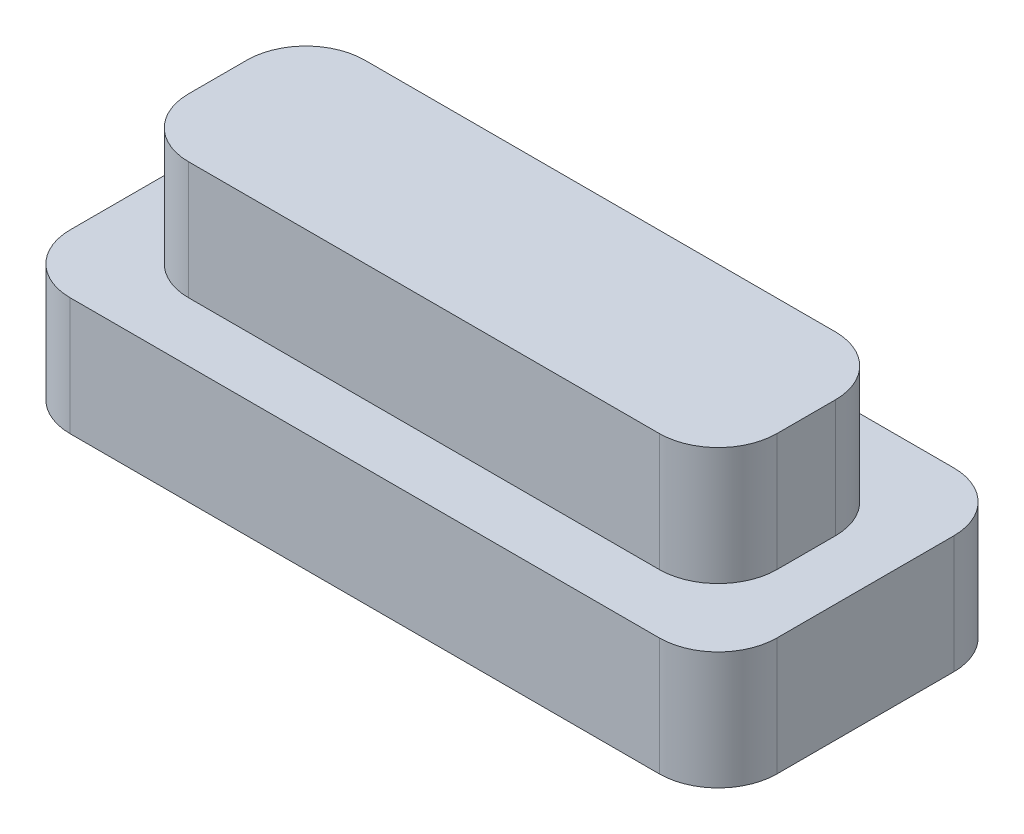
ISO-10303-21;
HEADER;
FILE_DESCRIPTION(('STEP AP214'),'2;1');
FILE_NAME('part.step','',(''),(''),'','','');
FILE_SCHEMA(('AUTOMOTIVE_DESIGN { 1 0 10303 214 1 1 1 1 }'));
ENDSEC;
DATA;
#1=APPLICATION_CONTEXT('core data for automotive mechanical design processes');
#2=APPLICATION_PROTOCOL_DEFINITION('international standard','automotive_design',2000,#1);
#3=PRODUCT_CONTEXT('',#1,'mechanical');
#4=PRODUCT('Part','Part','',(#3));
#5=PRODUCT_RELATED_PRODUCT_CATEGORY('part','',(#4));
#6=PRODUCT_DEFINITION_FORMATION('','',#4);
#7=PRODUCT_DEFINITION_CONTEXT('part definition',#1,'design');
#8=PRODUCT_DEFINITION('design','',#6,#7);
#9=PRODUCT_DEFINITION_SHAPE('','',#8);
#10=(LENGTH_UNIT() NAMED_UNIT(*) SI_UNIT(.MILLI.,.METRE.));
#11=(NAMED_UNIT(*) PLANE_ANGLE_UNIT() SI_UNIT($,.RADIAN.));
#12=(NAMED_UNIT(*) SI_UNIT($,.STERADIAN.) SOLID_ANGLE_UNIT());
#13=UNCERTAINTY_MEASURE_WITH_UNIT(LENGTH_MEASURE(1.E-05),#10,'distance_accuracy_value','');
#14=(GEOMETRIC_REPRESENTATION_CONTEXT(3) GLOBAL_UNCERTAINTY_ASSIGNED_CONTEXT((#13)) GLOBAL_UNIT_ASSIGNED_CONTEXT((#10,
#11,#12)) REPRESENTATION_CONTEXT('',''));
#15=CARTESIAN_POINT('',(0.,0.,0.));
#16=DIRECTION('',(0.,0.,1.));
#17=DIRECTION('',(1.,0.,0.));
#18=AXIS2_PLACEMENT_3D('',#15,#16,#17);
#19=CARTESIAN_POINT('',(-5.,2.,-1.5));
#20=DIRECTION('',(0.,-1.,0.));
#21=DIRECTION('',(0.,0.,-1.));
#22=AXIS2_PLACEMENT_3D('',#19,#20,#21);
#23=CYLINDRICAL_SURFACE('',#22,1.);
#24=CARTESIAN_POINT('',(-5.,0.,-1.5));
#25=DIRECTION('',(0.,1.,0.));
#26=DIRECTION('',(0.,0.,-1.));
#27=AXIS2_PLACEMENT_3D('',#24,#25,#26);
#28=CIRCLE('',#27,1.);
#29=CARTESIAN_POINT('',(-4.99999999999999,0.,-2.5));
#30=VERTEX_POINT('',#29);
#31=CARTESIAN_POINT('',(-6.,0.,-1.49999999999999));
#32=VERTEX_POINT('',#31);
#33=EDGE_CURVE('E141',#30,#32,#28,.T.);
#34=ORIENTED_EDGE('',*,*,#33,.T.);
#35=DIRECTION('',(0.,-1.,0.));
#36=VECTOR('',#35,1.);
#37=CARTESIAN_POINT('',(-6.,2.,-1.49999999999999));
#38=LINE('',#37,#36);
#39=CARTESIAN_POINT('',(-6.,2.,-1.49999999999999));
#40=VERTEX_POINT('',#39);
#41=EDGE_CURVE('E11',#40,#32,#38,.T.);
#42=ORIENTED_EDGE('',*,*,#41,.F.);
#43=CARTESIAN_POINT('',(-5.,2.,-1.5));
#44=DIRECTION('',(0.,1.,0.));
#45=DIRECTION('',(0.,0.,-1.));
#46=AXIS2_PLACEMENT_3D('',#43,#44,#45);
#47=CIRCLE('',#46,1.);
#48=CARTESIAN_POINT('',(-4.99999999999999,2.,-2.5));
#49=VERTEX_POINT('',#48);
#50=EDGE_CURVE('E157',#49,#40,#47,.T.);
#51=ORIENTED_EDGE('',*,*,#50,.F.);
#52=DIRECTION('',(0.,-1.,0.));
#53=VECTOR('',#52,1.);
#54=CARTESIAN_POINT('',(-4.99999999999999,2.,-2.5));
#55=LINE('',#54,#53);
#56=EDGE_CURVE('E137',#49,#30,#55,.T.);
#57=ORIENTED_EDGE('',*,*,#56,.T.);
#58=EDGE_LOOP('',(#34,#42,#51,#57));
#59=FACE_BOUND('',#58,.T.);
#60=ADVANCED_FACE('F33',(#59),#23,.T.);
#61=CARTESIAN_POINT('',(-6.,2.,-1.49999999999999));
#62=DIRECTION('',(1.,0.,0.));
#63=DIRECTION('',(0.,0.,-1.));
#64=AXIS2_PLACEMENT_3D('',#61,#62,#63);
#65=PLANE('',#64);
#66=DIRECTION('',(0.,0.,1.));
#67=VECTOR('',#66,1.);
#68=CARTESIAN_POINT('',(-6.,0.,-1.49999999999999));
#69=LINE('',#68,#67);
#70=CARTESIAN_POINT('',(-6.,0.,1.49999999999999));
#71=VERTEX_POINT('',#70);
#72=EDGE_CURVE('E144',#32,#71,#69,.T.);
#73=ORIENTED_EDGE('',*,*,#72,.T.);
#74=DIRECTION('',(0.,-1.,0.));
#75=VECTOR('',#74,1.);
#76=CARTESIAN_POINT('',(-6.,2.,1.49999999999999));
#77=LINE('',#76,#75);
#78=CARTESIAN_POINT('',(-6.,2.,1.49999999999999));
#79=VERTEX_POINT('',#78);
#80=EDGE_CURVE('E40',#79,#71,#77,.T.);
#81=ORIENTED_EDGE('',*,*,#80,.F.);
#82=DIRECTION('',(0.,0.,1.));
#83=VECTOR('',#82,1.);
#84=CARTESIAN_POINT('',(-6.,2.,-1.49999999999999));
#85=LINE('',#84,#83);
#86=EDGE_CURVE('E97',#40,#79,#85,.T.);
#87=ORIENTED_EDGE('',*,*,#86,.F.);
#88=ORIENTED_EDGE('',*,*,#41,.T.);
#89=EDGE_LOOP('',(#73,#81,#87,#88));
#90=FACE_BOUND('',#89,.T.);
#91=ADVANCED_FACE('F332',(#90),#65,.F.);
#92=CARTESIAN_POINT('',(-5.,2.,1.5));
#93=DIRECTION('',(0.,-1.,0.));
#94=DIRECTION('',(0.,0.,-1.));
#95=AXIS2_PLACEMENT_3D('',#92,#93,#94);
#96=CYLINDRICAL_SURFACE('',#95,1.);
#97=CARTESIAN_POINT('',(-5.,0.,1.5));
#98=DIRECTION('',(0.,1.,0.));
#99=DIRECTION('',(0.,0.,-1.));
#100=AXIS2_PLACEMENT_3D('',#97,#98,#99);
#101=CIRCLE('',#100,1.);
#102=CARTESIAN_POINT('',(-4.99999999999999,0.,2.5));
#103=VERTEX_POINT('',#102);
#104=EDGE_CURVE('E147',#71,#103,#101,.T.);
#105=ORIENTED_EDGE('',*,*,#104,.T.);
#106=DIRECTION('',(0.,-1.,0.));
#107=VECTOR('',#106,1.);
#108=CARTESIAN_POINT('',(-4.99999999999999,2.,2.5));
#109=LINE('',#108,#107);
#110=CARTESIAN_POINT('',(-4.99999999999999,2.,2.5));
#111=VERTEX_POINT('',#110);
#112=EDGE_CURVE('E164',#111,#103,#109,.T.);
#113=ORIENTED_EDGE('',*,*,#112,.F.);
#114=CARTESIAN_POINT('',(-5.,2.,1.5));
#115=DIRECTION('',(0.,1.,0.));
#116=DIRECTION('',(0.,0.,-1.));
#117=AXIS2_PLACEMENT_3D('',#114,#115,#116);
#118=CIRCLE('',#117,1.);
#119=EDGE_CURVE('E172',#79,#111,#118,.T.);
#120=ORIENTED_EDGE('',*,*,#119,.F.);
#121=ORIENTED_EDGE('',*,*,#80,.T.);
#122=EDGE_LOOP('',(#105,#113,#120,#121));
#123=FACE_BOUND('',#122,.T.);
#124=ADVANCED_FACE('F170',(#123),#96,.T.);
#125=CARTESIAN_POINT('',(-4.99999999999999,2.,2.5));
#126=DIRECTION('',(0.,0.,-1.));
#127=DIRECTION('',(-1.,0.,0.));
#128=AXIS2_PLACEMENT_3D('',#125,#126,#127);
#129=PLANE('',#128);
#130=DIRECTION('',(1.,0.,0.));
#131=VECTOR('',#130,1.);
#132=CARTESIAN_POINT('',(-4.99999999999999,0.,2.5));
#133=LINE('',#132,#131);
#134=CARTESIAN_POINT('',(4.99999999999999,0.,2.5));
#135=VERTEX_POINT('',#134);
#136=EDGE_CURVE('E149',#103,#135,#133,.T.);
#137=ORIENTED_EDGE('',*,*,#136,.T.);
#138=DIRECTION('',(0.,-1.,0.));
#139=VECTOR('',#138,1.);
#140=CARTESIAN_POINT('',(4.99999999999999,2.,2.5));
#141=LINE('',#140,#139);
#142=CARTESIAN_POINT('',(4.99999999999999,2.,2.5));
#143=VERTEX_POINT('',#142);
#144=EDGE_CURVE('E161',#143,#135,#141,.T.);
#145=ORIENTED_EDGE('',*,*,#144,.F.);
#146=DIRECTION('',(1.,0.,0.));
#147=VECTOR('',#146,1.);
#148=CARTESIAN_POINT('',(-4.99999999999999,2.,2.5));
#149=LINE('',#148,#147);
#150=EDGE_CURVE('E184',#111,#143,#149,.T.);
#151=ORIENTED_EDGE('',*,*,#150,.F.);
#152=ORIENTED_EDGE('',*,*,#112,.T.);
#153=EDGE_LOOP('',(#137,#145,#151,#152));
#154=FACE_BOUND('',#153,.T.);
#155=ADVANCED_FACE('F180',(#154),#129,.F.);
#156=CARTESIAN_POINT('',(5.,2.,1.5));
#157=DIRECTION('',(0.,-1.,0.));
#158=DIRECTION('',(0.,0.,-1.));
#159=AXIS2_PLACEMENT_3D('',#156,#157,#158);
#160=CYLINDRICAL_SURFACE('',#159,1.);
#161=CARTESIAN_POINT('',(5.,0.,1.5));
#162=DIRECTION('',(0.,1.,0.));
#163=DIRECTION('',(0.,0.,1.));
#164=AXIS2_PLACEMENT_3D('',#161,#162,#163);
#165=CIRCLE('',#164,1.);
#166=CARTESIAN_POINT('',(6.,0.,1.49999999999999));
#167=VERTEX_POINT('',#166);
#168=EDGE_CURVE('E151',#135,#167,#165,.T.);
#169=ORIENTED_EDGE('',*,*,#168,.T.);
#170=DIRECTION('',(0.,-1.,0.));
#171=VECTOR('',#170,1.);
#172=CARTESIAN_POINT('',(6.,2.,1.49999999999999));
#173=LINE('',#172,#171);
#174=CARTESIAN_POINT('',(6.,2.,1.49999999999999));
#175=VERTEX_POINT('',#174);
#176=EDGE_CURVE('E132',#175,#167,#173,.T.);
#177=ORIENTED_EDGE('',*,*,#176,.F.);
#178=CARTESIAN_POINT('',(5.,2.,1.5));
#179=DIRECTION('',(0.,1.,0.));
#180=DIRECTION('',(0.,0.,1.));
#181=AXIS2_PLACEMENT_3D('',#178,#179,#180);
#182=CIRCLE('',#181,1.);
#183=EDGE_CURVE('E120',#143,#175,#182,.T.);
#184=ORIENTED_EDGE('',*,*,#183,.F.);
#185=ORIENTED_EDGE('',*,*,#144,.T.);
#186=EDGE_LOOP('',(#169,#177,#184,#185));
#187=FACE_BOUND('',#186,.T.);
#188=ADVANCED_FACE('F183',(#187),#160,.T.);
#189=CARTESIAN_POINT('',(6.,2.,-1.49999999999999));
#190=DIRECTION('',(-1.,0.,0.));
#191=DIRECTION('',(0.,0.,1.));
#192=AXIS2_PLACEMENT_3D('',#189,#190,#191);
#193=PLANE('',#192);
#194=DIRECTION('',(0.,0.,-1.));
#195=VECTOR('',#194,1.);
#196=CARTESIAN_POINT('',(6.,0.,-1.49999999999999));
#197=LINE('',#196,#195);
#198=CARTESIAN_POINT('',(6.,0.,-1.49999999999999));
#199=VERTEX_POINT('',#198);
#200=EDGE_CURVE('E129',#167,#199,#197,.T.);
#201=ORIENTED_EDGE('',*,*,#200,.T.);
#202=DIRECTION('',(0.,-1.,0.));
#203=VECTOR('',#202,1.);
#204=CARTESIAN_POINT('',(6.,2.,-1.49999999999999));
#205=LINE('',#204,#203);
#206=CARTESIAN_POINT('',(6.,2.,-1.49999999999999));
#207=VERTEX_POINT('',#206);
#208=EDGE_CURVE('E126',#207,#199,#205,.T.);
#209=ORIENTED_EDGE('',*,*,#208,.F.);
#210=DIRECTION('',(0.,0.,-1.));
#211=VECTOR('',#210,1.);
#212=CARTESIAN_POINT('',(6.,2.,-1.49999999999999));
#213=LINE('',#212,#211);
#214=EDGE_CURVE('E113',#175,#207,#213,.T.);
#215=ORIENTED_EDGE('',*,*,#214,.F.);
#216=ORIENTED_EDGE('',*,*,#176,.T.);
#217=EDGE_LOOP('',(#201,#209,#215,#216));
#218=FACE_BOUND('',#217,.T.);
#219=ADVANCED_FACE('F127',(#218),#193,.F.);
#220=CARTESIAN_POINT('',(5.,2.,-1.5));
#221=DIRECTION('',(0.,-1.,0.));
#222=DIRECTION('',(0.,0.,-1.));
#223=AXIS2_PLACEMENT_3D('',#220,#221,#222);
#224=CYLINDRICAL_SURFACE('',#223,1.);
#225=CARTESIAN_POINT('',(5.,0.,-1.5));
#226=DIRECTION('',(0.,1.,0.));
#227=DIRECTION('',(0.,0.,1.));
#228=AXIS2_PLACEMENT_3D('',#225,#226,#227);
#229=CIRCLE('',#228,1.);
#230=CARTESIAN_POINT('',(4.99999999999999,0.,-2.5));
#231=VERTEX_POINT('',#230);
#232=EDGE_CURVE('E154',#199,#231,#229,.T.);
#233=ORIENTED_EDGE('',*,*,#232,.T.);
#234=DIRECTION('',(0.,-1.,0.));
#235=VECTOR('',#234,1.);
#236=CARTESIAN_POINT('',(4.99999999999999,2.,-2.5));
#237=LINE('',#236,#235);
#238=CARTESIAN_POINT('',(4.99999999999999,2.,-2.5));
#239=VERTEX_POINT('',#238);
#240=EDGE_CURVE('E133',#239,#231,#237,.T.);
#241=ORIENTED_EDGE('',*,*,#240,.F.);
#242=CARTESIAN_POINT('',(5.,2.,-1.5));
#243=DIRECTION('',(0.,1.,0.));
#244=DIRECTION('',(0.,0.,1.));
#245=AXIS2_PLACEMENT_3D('',#242,#243,#244);
#246=CIRCLE('',#245,1.);
#247=EDGE_CURVE('E117',#207,#239,#246,.T.);
#248=ORIENTED_EDGE('',*,*,#247,.F.);
#249=ORIENTED_EDGE('',*,*,#208,.T.);
#250=EDGE_LOOP('',(#233,#241,#248,#249));
#251=FACE_BOUND('',#250,.T.);
#252=ADVANCED_FACE('F135',(#251),#224,.T.);
#253=CARTESIAN_POINT('',(-4.99999999999999,2.,-2.5));
#254=DIRECTION('',(0.,0.,1.));
#255=DIRECTION('',(1.,0.,0.));
#256=AXIS2_PLACEMENT_3D('',#253,#254,#255);
#257=PLANE('',#256);
#258=DIRECTION('',(-1.,0.,0.));
#259=VECTOR('',#258,1.);
#260=CARTESIAN_POINT('',(-4.99999999999999,0.,-2.5));
#261=LINE('',#260,#259);
#262=EDGE_CURVE('E89',#231,#30,#261,.T.);
#263=ORIENTED_EDGE('',*,*,#262,.T.);
#264=ORIENTED_EDGE('',*,*,#56,.F.);
#265=DIRECTION('',(-1.,0.,0.));
#266=VECTOR('',#265,1.);
#267=CARTESIAN_POINT('',(-4.99999999999999,2.,-2.5));
#268=LINE('',#267,#266);
#269=EDGE_CURVE('E56',#239,#49,#268,.T.);
#270=ORIENTED_EDGE('',*,*,#269,.F.);
#271=ORIENTED_EDGE('',*,*,#240,.T.);
#272=EDGE_LOOP('',(#263,#264,#270,#271));
#273=FACE_BOUND('',#272,.T.);
#274=ADVANCED_FACE('F339',(#273),#257,.F.);
#275=CARTESIAN_POINT('',(-5.,2.,-1.5));
#276=DIRECTION('',(0.,-1.,0.));
#277=DIRECTION('',(0.,0.,-1.));
#278=AXIS2_PLACEMENT_3D('',#275,#276,#277);
#279=PLANE('',#278);
#280=CARTESIAN_POINT('',(3.995,2.,-0.495));
#281=DIRECTION('',(0.,-1.,0.));
#282=DIRECTION('',(0.,0.,-1.));
#283=AXIS2_PLACEMENT_3D('',#280,#281,#282);
#284=CIRCLE('',#283,1.);
#285=CARTESIAN_POINT('',(3.99499999999999,2.,-1.495));
#286=VERTEX_POINT('',#285);
#287=CARTESIAN_POINT('',(4.995,2.,-0.494999999999993));
#288=VERTEX_POINT('',#287);
#289=EDGE_CURVE('E212',#286,#288,#284,.T.);
#290=ORIENTED_EDGE('',*,*,#289,.T.);
#291=DIRECTION('',(0.,0.,1.));
#292=VECTOR('',#291,1.);
#293=CARTESIAN_POINT('',(4.995,2.,-0.494999999999993));
#294=LINE('',#293,#292);
#295=CARTESIAN_POINT('',(4.995,2.,0.494999999999993));
#296=VERTEX_POINT('',#295);
#297=EDGE_CURVE('E47',#288,#296,#294,.T.);
#298=ORIENTED_EDGE('',*,*,#297,.T.);
#299=CARTESIAN_POINT('',(3.995,2.,0.495));
#300=DIRECTION('',(0.,1.,0.));
#301=DIRECTION('',(0.,0.,1.));
#302=AXIS2_PLACEMENT_3D('',#299,#300,#301);
#303=CIRCLE('',#302,1.);
#304=CARTESIAN_POINT('',(3.99499999999999,2.,1.495));
#305=VERTEX_POINT('',#304);
#306=EDGE_CURVE('E231',#305,#296,#303,.T.);
#307=ORIENTED_EDGE('',*,*,#306,.F.);
#308=DIRECTION('',(1.,0.,0.));
#309=VECTOR('',#308,1.);
#310=CARTESIAN_POINT('',(-3.99499999999999,2.,1.495));
#311=LINE('',#310,#309);
#312=CARTESIAN_POINT('',(-3.99499999999999,2.,1.495));
#313=VERTEX_POINT('',#312);
#314=EDGE_CURVE('E228',#313,#305,#311,.T.);
#315=ORIENTED_EDGE('',*,*,#314,.F.);
#316=CARTESIAN_POINT('',(-3.995,2.,0.495));
#317=DIRECTION('',(0.,-1.,0.));
#318=DIRECTION('',(0.,0.,-1.));
#319=AXIS2_PLACEMENT_3D('',#316,#317,#318);
#320=CIRCLE('',#319,1.);
#321=CARTESIAN_POINT('',(-4.995,2.,0.494999999999994));
#322=VERTEX_POINT('',#321);
#323=EDGE_CURVE('E225',#313,#322,#320,.T.);
#324=ORIENTED_EDGE('',*,*,#323,.T.);
#325=DIRECTION('',(0.,0.,1.));
#326=VECTOR('',#325,1.);
#327=CARTESIAN_POINT('',(-4.995,2.,-0.494999999999993));
#328=LINE('',#327,#326);
#329=CARTESIAN_POINT('',(-4.995,2.,-0.494999999999993));
#330=VERTEX_POINT('',#329);
#331=EDGE_CURVE('E222',#330,#322,#328,.T.);
#332=ORIENTED_EDGE('',*,*,#331,.F.);
#333=CARTESIAN_POINT('',(-3.995,2.,-0.495));
#334=DIRECTION('',(0.,-1.,0.));
#335=DIRECTION('',(0.,0.,-1.));
#336=AXIS2_PLACEMENT_3D('',#333,#334,#335);
#337=CIRCLE('',#336,1.);
#338=CARTESIAN_POINT('',(-3.995,2.,-1.495));
#339=VERTEX_POINT('',#338);
#340=EDGE_CURVE('E219',#330,#339,#337,.T.);
#341=ORIENTED_EDGE('',*,*,#340,.T.);
#342=DIRECTION('',(1.,0.,0.));
#343=VECTOR('',#342,1.);
#344=CARTESIAN_POINT('',(-3.99499999999999,2.,-1.495));
#345=LINE('',#344,#343);
#346=EDGE_CURVE('E216',#339,#286,#345,.T.);
#347=ORIENTED_EDGE('',*,*,#346,.T.);
#348=EDGE_LOOP('',(#290,#298,#307,#315,#324,#332,#341,#347));
#349=FACE_BOUND('',#348,.T.);
#350=ORIENTED_EDGE('',*,*,#50,.T.);
#351=ORIENTED_EDGE('',*,*,#86,.T.);
#352=ORIENTED_EDGE('',*,*,#119,.T.);
#353=ORIENTED_EDGE('',*,*,#150,.T.);
#354=ORIENTED_EDGE('',*,*,#183,.T.);
#355=ORIENTED_EDGE('',*,*,#214,.T.);
#356=ORIENTED_EDGE('',*,*,#247,.T.);
#357=ORIENTED_EDGE('',*,*,#269,.T.);
#358=EDGE_LOOP('',(#350,#351,#352,#353,#354,#355,#356,#357));
#359=FACE_BOUND('',#358,.T.);
#360=ADVANCED_FACE('F115',(#349,#359),#279,.F.);
#361=CARTESIAN_POINT('',(-5.,0.,-1.5));
#362=DIRECTION('',(0.,-1.,0.));
#363=DIRECTION('',(0.,0.,-1.));
#364=AXIS2_PLACEMENT_3D('',#361,#362,#363);
#365=PLANE('',#364);
#366=ORIENTED_EDGE('',*,*,#33,.F.);
#367=ORIENTED_EDGE('',*,*,#262,.F.);
#368=ORIENTED_EDGE('',*,*,#232,.F.);
#369=ORIENTED_EDGE('',*,*,#200,.F.);
#370=ORIENTED_EDGE('',*,*,#168,.F.);
#371=ORIENTED_EDGE('',*,*,#136,.F.);
#372=ORIENTED_EDGE('',*,*,#104,.F.);
#373=ORIENTED_EDGE('',*,*,#72,.F.);
#374=EDGE_LOOP('',(#366,#367,#368,#369,#370,#371,#372,#373));
#375=FACE_BOUND('',#374,.T.);
#376=ADVANCED_FACE('F176',(#375),#365,.T.);
#377=CARTESIAN_POINT('',(4.995,4.,-0.494999999999993));
#378=DIRECTION('',(1.,0.,0.));
#379=DIRECTION('',(0.,0.,-1.));
#380=AXIS2_PLACEMENT_3D('',#377,#378,#379);
#381=PLANE('',#380);
#382=ORIENTED_EDGE('',*,*,#297,.F.);
#383=DIRECTION('',(0.,-1.,0.));
#384=VECTOR('',#383,1.);
#385=CARTESIAN_POINT('',(4.995,4.,-0.494999999999993));
#386=LINE('',#385,#384);
#387=CARTESIAN_POINT('',(4.995,4.,-0.494999999999993));
#388=VERTEX_POINT('',#387);
#389=EDGE_CURVE('E145',#388,#288,#386,.T.);
#390=ORIENTED_EDGE('',*,*,#389,.F.);
#391=DIRECTION('',(0.,0.,1.));
#392=VECTOR('',#391,1.);
#393=CARTESIAN_POINT('',(4.995,4.,-0.494999999999993));
#394=LINE('',#393,#392);
#395=CARTESIAN_POINT('',(4.995,4.,0.494999999999993));
#396=VERTEX_POINT('',#395);
#397=EDGE_CURVE('E215',#388,#396,#394,.T.);
#398=ORIENTED_EDGE('',*,*,#397,.T.);
#399=DIRECTION('',(0.,-1.,0.));
#400=VECTOR('',#399,1.);
#401=CARTESIAN_POINT('',(4.995,4.,0.494999999999993));
#402=LINE('',#401,#400);
#403=EDGE_CURVE('E190',#396,#296,#402,.T.);
#404=ORIENTED_EDGE('',*,*,#403,.T.);
#405=EDGE_LOOP('',(#382,#390,#398,#404));
#406=FACE_BOUND('',#405,.T.);
#407=ADVANCED_FACE('F258',(#406),#381,.T.);
#408=CARTESIAN_POINT('',(3.995,4.,-0.495));
#409=DIRECTION('',(0.,-1.,0.));
#410=DIRECTION('',(0.,0.,-1.));
#411=AXIS2_PLACEMENT_3D('',#408,#409,#410);
#412=CYLINDRICAL_SURFACE('',#411,1.);
#413=ORIENTED_EDGE('',*,*,#289,.F.);
#414=DIRECTION('',(0.,-1.,0.));
#415=VECTOR('',#414,1.);
#416=CARTESIAN_POINT('',(3.99499999999999,4.,-1.495));
#417=LINE('',#416,#415);
#418=CARTESIAN_POINT('',(3.99499999999999,4.,-1.495));
#419=VERTEX_POINT('',#418);
#420=EDGE_CURVE('E208',#419,#286,#417,.T.);
#421=ORIENTED_EDGE('',*,*,#420,.F.);
#422=CARTESIAN_POINT('',(3.995,4.,-0.495));
#423=DIRECTION('',(0.,-1.,0.));
#424=DIRECTION('',(0.,0.,-1.));
#425=AXIS2_PLACEMENT_3D('',#422,#423,#424);
#426=CIRCLE('',#425,1.);
#427=EDGE_CURVE('E193',#419,#388,#426,.T.);
#428=ORIENTED_EDGE('',*,*,#427,.T.);
#429=ORIENTED_EDGE('',*,*,#389,.T.);
#430=EDGE_LOOP('',(#413,#421,#428,#429));
#431=FACE_BOUND('',#430,.T.);
#432=ADVANCED_FACE('F273',(#431),#412,.T.);
#433=CARTESIAN_POINT('',(-3.99499999999999,4.,-1.495));
#434=DIRECTION('',(0.,0.,-1.));
#435=DIRECTION('',(-1.,0.,0.));
#436=AXIS2_PLACEMENT_3D('',#433,#434,#435);
#437=PLANE('',#436);
#438=ORIENTED_EDGE('',*,*,#346,.F.);
#439=DIRECTION('',(0.,-1.,0.));
#440=VECTOR('',#439,1.);
#441=CARTESIAN_POINT('',(-3.995,4.,-1.495));
#442=LINE('',#441,#440);
#443=CARTESIAN_POINT('',(-3.995,4.,-1.495));
#444=VERTEX_POINT('',#443);
#445=EDGE_CURVE('E205',#444,#339,#442,.T.);
#446=ORIENTED_EDGE('',*,*,#445,.F.);
#447=DIRECTION('',(1.,0.,0.));
#448=VECTOR('',#447,1.);
#449=CARTESIAN_POINT('',(-3.99499999999999,4.,-1.495));
#450=LINE('',#449,#448);
#451=EDGE_CURVE('E237',#444,#419,#450,.T.);
#452=ORIENTED_EDGE('',*,*,#451,.T.);
#453=ORIENTED_EDGE('',*,*,#420,.T.);
#454=EDGE_LOOP('',(#438,#446,#452,#453));
#455=FACE_BOUND('',#454,.T.);
#456=ADVANCED_FACE('F279',(#455),#437,.T.);
#457=CARTESIAN_POINT('',(-3.995,4.,-0.495));
#458=DIRECTION('',(0.,-1.,0.));
#459=DIRECTION('',(0.,0.,-1.));
#460=AXIS2_PLACEMENT_3D('',#457,#458,#459);
#461=CYLINDRICAL_SURFACE('',#460,1.);
#462=ORIENTED_EDGE('',*,*,#340,.F.);
#463=DIRECTION('',(0.,-1.,0.));
#464=VECTOR('',#463,1.);
#465=CARTESIAN_POINT('',(-4.995,4.,-0.494999999999993));
#466=LINE('',#465,#464);
#467=CARTESIAN_POINT('',(-4.995,4.,-0.494999999999993));
#468=VERTEX_POINT('',#467);
#469=EDGE_CURVE('E202',#468,#330,#466,.T.);
#470=ORIENTED_EDGE('',*,*,#469,.F.);
#471=CARTESIAN_POINT('',(-3.995,4.,-0.495));
#472=DIRECTION('',(0.,-1.,0.));
#473=DIRECTION('',(0.,0.,-1.));
#474=AXIS2_PLACEMENT_3D('',#471,#472,#473);
#475=CIRCLE('',#474,1.);
#476=EDGE_CURVE('E240',#468,#444,#475,.T.);
#477=ORIENTED_EDGE('',*,*,#476,.T.);
#478=ORIENTED_EDGE('',*,*,#445,.T.);
#479=EDGE_LOOP('',(#462,#470,#477,#478));
#480=FACE_BOUND('',#479,.T.);
#481=ADVANCED_FACE('F286',(#480),#461,.T.);
#482=CARTESIAN_POINT('',(-4.995,4.,-0.494999999999993));
#483=DIRECTION('',(1.,0.,0.));
#484=DIRECTION('',(0.,0.,-1.));
#485=AXIS2_PLACEMENT_3D('',#482,#483,#484);
#486=PLANE('',#485);
#487=ORIENTED_EDGE('',*,*,#331,.T.);
#488=DIRECTION('',(0.,-1.,0.));
#489=VECTOR('',#488,1.);
#490=CARTESIAN_POINT('',(-4.995,4.,0.494999999999994));
#491=LINE('',#490,#489);
#492=CARTESIAN_POINT('',(-4.995,4.,0.494999999999994));
#493=VERTEX_POINT('',#492);
#494=EDGE_CURVE('E199',#493,#322,#491,.T.);
#495=ORIENTED_EDGE('',*,*,#494,.F.);
#496=DIRECTION('',(0.,0.,1.));
#497=VECTOR('',#496,1.);
#498=CARTESIAN_POINT('',(-4.995,4.,-0.494999999999993));
#499=LINE('',#498,#497);
#500=EDGE_CURVE('E243',#468,#493,#499,.T.);
#501=ORIENTED_EDGE('',*,*,#500,.F.);
#502=ORIENTED_EDGE('',*,*,#469,.T.);
#503=EDGE_LOOP('',(#487,#495,#501,#502));
#504=FACE_BOUND('',#503,.T.);
#505=ADVANCED_FACE('F295',(#504),#486,.F.);
#506=CARTESIAN_POINT('',(-3.995,4.,0.495));
#507=DIRECTION('',(0.,-1.,0.));
#508=DIRECTION('',(0.,0.,-1.));
#509=AXIS2_PLACEMENT_3D('',#506,#507,#508);
#510=CYLINDRICAL_SURFACE('',#509,1.);
#511=ORIENTED_EDGE('',*,*,#323,.F.);
#512=DIRECTION('',(0.,-1.,0.));
#513=VECTOR('',#512,1.);
#514=CARTESIAN_POINT('',(-3.99499999999999,4.,1.495));
#515=LINE('',#514,#513);
#516=CARTESIAN_POINT('',(-3.99499999999999,4.,1.495));
#517=VERTEX_POINT('',#516);
#518=EDGE_CURVE('E196',#517,#313,#515,.T.);
#519=ORIENTED_EDGE('',*,*,#518,.F.);
#520=CARTESIAN_POINT('',(-3.995,4.,0.495));
#521=DIRECTION('',(0.,-1.,0.));
#522=DIRECTION('',(0.,0.,-1.));
#523=AXIS2_PLACEMENT_3D('',#520,#521,#522);
#524=CIRCLE('',#523,1.);
#525=EDGE_CURVE('E246',#517,#493,#524,.T.);
#526=ORIENTED_EDGE('',*,*,#525,.T.);
#527=ORIENTED_EDGE('',*,*,#494,.T.);
#528=EDGE_LOOP('',(#511,#519,#526,#527));
#529=FACE_BOUND('',#528,.T.);
#530=ADVANCED_FACE('F312',(#529),#510,.T.);
#531=CARTESIAN_POINT('',(-3.99499999999999,4.,1.495));
#532=DIRECTION('',(0.,0.,-1.));
#533=DIRECTION('',(-1.,0.,0.));
#534=AXIS2_PLACEMENT_3D('',#531,#532,#533);
#535=PLANE('',#534);
#536=ORIENTED_EDGE('',*,*,#314,.T.);
#537=DIRECTION('',(0.,-1.,0.));
#538=VECTOR('',#537,1.);
#539=CARTESIAN_POINT('',(3.99499999999999,4.,1.495));
#540=LINE('',#539,#538);
#541=CARTESIAN_POINT('',(3.99499999999999,4.,1.495));
#542=VERTEX_POINT('',#541);
#543=EDGE_CURVE('E192',#542,#305,#540,.T.);
#544=ORIENTED_EDGE('',*,*,#543,.F.);
#545=DIRECTION('',(1.,0.,0.));
#546=VECTOR('',#545,1.);
#547=CARTESIAN_POINT('',(-3.99499999999999,4.,1.495));
#548=LINE('',#547,#546);
#549=EDGE_CURVE('E249',#517,#542,#548,.T.);
#550=ORIENTED_EDGE('',*,*,#549,.F.);
#551=ORIENTED_EDGE('',*,*,#518,.T.);
#552=EDGE_LOOP('',(#536,#544,#550,#551));
#553=FACE_BOUND('',#552,.T.);
#554=ADVANCED_FACE('F318',(#553),#535,.F.);
#555=CARTESIAN_POINT('',(3.995,4.,0.495));
#556=DIRECTION('',(0.,-1.,0.));
#557=DIRECTION('',(0.,0.,-1.));
#558=AXIS2_PLACEMENT_3D('',#555,#556,#557);
#559=CYLINDRICAL_SURFACE('',#558,1.);
#560=ORIENTED_EDGE('',*,*,#306,.T.);
#561=ORIENTED_EDGE('',*,*,#403,.F.);
#562=CARTESIAN_POINT('',(3.995,4.,0.495));
#563=DIRECTION('',(0.,1.,0.));
#564=DIRECTION('',(0.,0.,1.));
#565=AXIS2_PLACEMENT_3D('',#562,#563,#564);
#566=CIRCLE('',#565,1.);
#567=EDGE_CURVE('E252',#542,#396,#566,.T.);
#568=ORIENTED_EDGE('',*,*,#567,.F.);
#569=ORIENTED_EDGE('',*,*,#543,.T.);
#570=EDGE_LOOP('',(#560,#561,#568,#569));
#571=FACE_BOUND('',#570,.T.);
#572=ADVANCED_FACE('F321',(#571),#559,.T.);
#573=CARTESIAN_POINT('',(3.995,4.,0.495));
#574=DIRECTION('',(0.,1.,0.));
#575=DIRECTION('',(0.,0.,1.));
#576=AXIS2_PLACEMENT_3D('',#573,#574,#575);
#577=PLANE('',#576);
#578=ORIENTED_EDGE('',*,*,#397,.F.);
#579=ORIENTED_EDGE('',*,*,#427,.F.);
#580=ORIENTED_EDGE('',*,*,#451,.F.);
#581=ORIENTED_EDGE('',*,*,#476,.F.);
#582=ORIENTED_EDGE('',*,*,#500,.T.);
#583=ORIENTED_EDGE('',*,*,#525,.F.);
#584=ORIENTED_EDGE('',*,*,#549,.T.);
#585=ORIENTED_EDGE('',*,*,#567,.T.);
#586=EDGE_LOOP('',(#578,#579,#580,#581,#582,#583,#584,#585));
#587=FACE_BOUND('',#586,.T.);
#588=ADVANCED_FACE('F265',(#587),#577,.T.);
#589=CLOSED_SHELL('',(#60,#91,#124,#155,#188,#219,#252,#274,#360,#376,#407,#432,#456,#481,#505,
#530,#554,#572,#588));
#590=MANIFOLD_SOLID_BREP('B2',#589);
#591=ADVANCED_BREP_SHAPE_REPRESENTATION('',(#18,#590),#14);
#592=SHAPE_DEFINITION_REPRESENTATION(#9,#591);
ENDSEC;
END-ISO-10303-21;
